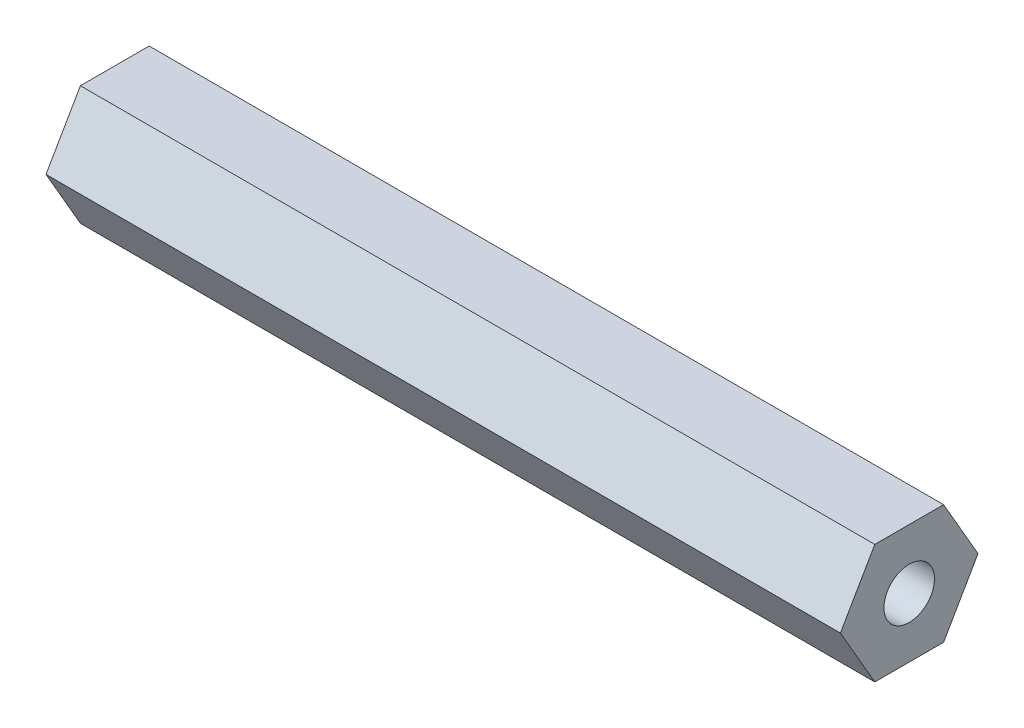
ISO-10303-21;
HEADER;
FILE_DESCRIPTION(('STEP AP214'),'2;1');
FILE_NAME('part.step','',(''),(''),'','','');
FILE_SCHEMA(('AUTOMOTIVE_DESIGN { 1 0 10303 214 1 1 1 1 }'));
ENDSEC;
DATA;
#1=APPLICATION_CONTEXT('core data for automotive mechanical design processes');
#2=APPLICATION_PROTOCOL_DEFINITION('international standard','automotive_design',2000,#1);
#3=PRODUCT_CONTEXT('',#1,'mechanical');
#4=PRODUCT('Part','Part','',(#3));
#5=PRODUCT_RELATED_PRODUCT_CATEGORY('part','',(#4));
#6=PRODUCT_DEFINITION_FORMATION('','',#4);
#7=PRODUCT_DEFINITION_CONTEXT('part definition',#1,'design');
#8=PRODUCT_DEFINITION('design','',#6,#7);
#9=PRODUCT_DEFINITION_SHAPE('','',#8);
#10=(LENGTH_UNIT() NAMED_UNIT(*) SI_UNIT(.MILLI.,.METRE.));
#11=(NAMED_UNIT(*) PLANE_ANGLE_UNIT() SI_UNIT($,.RADIAN.));
#12=(NAMED_UNIT(*) SI_UNIT($,.STERADIAN.) SOLID_ANGLE_UNIT());
#13=UNCERTAINTY_MEASURE_WITH_UNIT(LENGTH_MEASURE(1.E-05),#10,'distance_accuracy_value','');
#14=(GEOMETRIC_REPRESENTATION_CONTEXT(3) GLOBAL_UNCERTAINTY_ASSIGNED_CONTEXT((#13)) GLOBAL_UNIT_ASSIGNED_CONTEXT((#10,
#11,#12)) REPRESENTATION_CONTEXT('',''));
#15=CARTESIAN_POINT('',(0.,0.,0.));
#16=DIRECTION('',(0.,0.,1.));
#17=DIRECTION('',(1.,0.,0.));
#18=AXIS2_PLACEMENT_3D('',#15,#16,#17);
#19=CARTESIAN_POINT('',(38.1,0.,0.));
#20=DIRECTION('',(1.,0.,0.));
#21=DIRECTION('',(0.,1.,0.));
#22=AXIS2_PLACEMENT_3D('',#19,#20,#21);
#23=PLANE('',#22);
#24=CARTESIAN_POINT('',(38.1,0.,0.));
#25=DIRECTION('',(1.,0.,0.));
#26=DIRECTION('',(0.,0.,-1.));
#27=AXIS2_PLACEMENT_3D('',#24,#25,#26);
#28=CIRCLE('',#27,2.0193);
#29=CARTESIAN_POINT('',(38.1,0.,-2.0193));
#30=VERTEX_POINT('',#29);
#31=EDGE_CURVE('E166',#30,#30,#28,.T.);
#32=ORIENTED_EDGE('',*,*,#31,.F.);
#33=EDGE_LOOP('',(#32));
#34=FACE_BOUND('',#33,.T.);
#35=DIRECTION('',(0.,0.866025403784442,-0.5));
#36=VECTOR('',#35,1.);
#37=CARTESIAN_POINT('',(38.1,-4.7625,-2.74963065701564));
#38=LINE('',#37,#36);
#39=CARTESIAN_POINT('',(38.1,-4.7625,-2.74963065701564));
#40=VERTEX_POINT('',#39);
#41=CARTESIAN_POINT('',(38.1,0.,-5.49926131403117));
#42=VERTEX_POINT('',#41);
#43=EDGE_CURVE('E162',#40,#42,#38,.T.);
#44=ORIENTED_EDGE('',*,*,#43,.T.);
#45=DIRECTION('',(0.,0.866025403784438,0.5));
#46=VECTOR('',#45,1.);
#47=CARTESIAN_POINT('',(38.1,0.,-5.49926131403117));
#48=LINE('',#47,#46);
#49=CARTESIAN_POINT('',(38.1,4.7625,-2.74963065701557));
#50=VERTEX_POINT('',#49);
#51=EDGE_CURVE('E98',#42,#50,#48,.T.);
#52=ORIENTED_EDGE('',*,*,#51,.T.);
#53=DIRECTION('',(0.,0.,1.));
#54=VECTOR('',#53,1.);
#55=CARTESIAN_POINT('',(38.1,4.7625,-2.74963065701557));
#56=LINE('',#55,#54);
#57=CARTESIAN_POINT('',(38.1,4.7625,2.7496306570156));
#58=VERTEX_POINT('',#57);
#59=EDGE_CURVE('E138',#50,#58,#56,.T.);
#60=ORIENTED_EDGE('',*,*,#59,.T.);
#61=DIRECTION('',(0.,-0.866025403784442,0.5));
#62=VECTOR('',#61,1.);
#63=CARTESIAN_POINT('',(38.1,4.7625,2.7496306570156));
#64=LINE('',#63,#62);
#65=CARTESIAN_POINT('',(38.1,0.,5.49926131403117));
#66=VERTEX_POINT('',#65);
#67=EDGE_CURVE('E135',#58,#66,#64,.T.);
#68=ORIENTED_EDGE('',*,*,#67,.T.);
#69=DIRECTION('',(0.,-0.866025403784435,-0.500000000000007));
#70=VECTOR('',#69,1.);
#71=CARTESIAN_POINT('',(38.1,0.,5.49926131403117));
#72=LINE('',#71,#70);
#73=CARTESIAN_POINT('',(38.1,-4.7625,2.74963065701554));
#74=VERTEX_POINT('',#73);
#75=EDGE_CURVE('E157',#66,#74,#72,.T.);
#76=ORIENTED_EDGE('',*,*,#75,.T.);
#77=DIRECTION('',(0.,0.,-1.));
#78=VECTOR('',#77,1.);
#79=CARTESIAN_POINT('',(38.1,-4.7625,2.74963065701554));
#80=LINE('',#79,#78);
#81=EDGE_CURVE('E55',#74,#40,#80,.T.);
#82=ORIENTED_EDGE('',*,*,#81,.T.);
#83=EDGE_LOOP('',(#44,#52,#60,#68,#76,#82));
#84=FACE_BOUND('',#83,.T.);
#85=ADVANCED_FACE('F47',(#34,#84),#23,.T.);
#86=CARTESIAN_POINT('',(38.1,-4.7625,2.74963065701554));
#87=DIRECTION('',(0.,1.,0.));
#88=DIRECTION('',(0.,0.,-1.));
#89=AXIS2_PLACEMENT_3D('',#86,#87,#88);
#90=PLANE('',#89);
#91=DIRECTION('',(-1.,0.,0.));
#92=VECTOR('',#91,1.);
#93=CARTESIAN_POINT('',(38.1,-4.7625,2.74963065701554));
#94=LINE('',#93,#92);
#95=CARTESIAN_POINT('',(-25.4,-4.76250000000003,2.74963065701553));
#96=VERTEX_POINT('',#95);
#97=EDGE_CURVE('E154',#74,#96,#94,.T.);
#98=ORIENTED_EDGE('',*,*,#97,.T.);
#99=DIRECTION('',(0.,0.,-1.));
#100=VECTOR('',#99,1.);
#101=CARTESIAN_POINT('',(-25.4,-4.7625,-5.49926131403119));
#102=LINE('',#101,#100);
#103=CARTESIAN_POINT('',(-25.4,-4.76250000000001,-2.74963065701564));
#104=VERTEX_POINT('',#103);
#105=EDGE_CURVE('E131',#96,#104,#102,.T.);
#106=ORIENTED_EDGE('',*,*,#105,.T.);
#107=DIRECTION('',(-1.,0.,0.));
#108=VECTOR('',#107,1.);
#109=CARTESIAN_POINT('',(38.1,-4.7625,-2.74963065701564));
#110=LINE('',#109,#108);
#111=EDGE_CURVE('E153',#40,#104,#110,.T.);
#112=ORIENTED_EDGE('',*,*,#111,.F.);
#113=ORIENTED_EDGE('',*,*,#81,.F.);
#114=EDGE_LOOP('',(#98,#106,#112,#113));
#115=FACE_BOUND('',#114,.T.);
#116=ADVANCED_FACE('F188',(#115),#90,.F.);
#117=CARTESIAN_POINT('',(38.1,0.,5.49926131403117));
#118=DIRECTION('',(0.,0.500000000000007,-0.866025403784435));
#119=DIRECTION('',(-1.,0.,0.));
#120=AXIS2_PLACEMENT_3D('',#117,#118,#119);
#121=PLANE('',#120);
#122=DIRECTION('',(-1.,0.,0.));
#123=VECTOR('',#122,1.);
#124=CARTESIAN_POINT('',(38.1,0.,5.49926131403117));
#125=LINE('',#124,#123);
#126=CARTESIAN_POINT('',(-25.4,0.,5.49926131403117));
#127=VERTEX_POINT('',#126);
#128=EDGE_CURVE('E144',#66,#127,#125,.T.);
#129=ORIENTED_EDGE('',*,*,#128,.T.);
#130=DIRECTION('',(0.,-0.866025403784435,-0.500000000000007));
#131=VECTOR('',#130,1.);
#132=CARTESIAN_POINT('',(-25.4,0.,5.49926131403117));
#133=LINE('',#132,#131);
#134=EDGE_CURVE('E119',#127,#96,#133,.T.);
#135=ORIENTED_EDGE('',*,*,#134,.T.);
#136=ORIENTED_EDGE('',*,*,#97,.F.);
#137=ORIENTED_EDGE('',*,*,#75,.F.);
#138=EDGE_LOOP('',(#129,#135,#136,#137));
#139=FACE_BOUND('',#138,.T.);
#140=ADVANCED_FACE('F49',(#139),#121,.F.);
#141=CARTESIAN_POINT('',(38.1,4.7625,2.7496306570156));
#142=DIRECTION('',(0.,-0.5,-0.866025403784442));
#143=DIRECTION('',(0.,-0.866025403784442,0.5));
#144=AXIS2_PLACEMENT_3D('',#141,#142,#143);
#145=PLANE('',#144);
#146=DIRECTION('',(-1.,0.,0.));
#147=VECTOR('',#146,1.);
#148=CARTESIAN_POINT('',(38.1,4.7625,2.7496306570156));
#149=LINE('',#148,#147);
#150=CARTESIAN_POINT('',(-25.4,4.76249999999998,2.7496306570156));
#151=VERTEX_POINT('',#150);
#152=EDGE_CURVE('E129',#58,#151,#149,.T.);
#153=ORIENTED_EDGE('',*,*,#152,.T.);
#154=DIRECTION('',(0.,-0.866025403784439,0.499999999999999));
#155=VECTOR('',#154,1.);
#156=CARTESIAN_POINT('',(-25.4,4.7625,2.7496306570156));
#157=LINE('',#156,#155);
#158=EDGE_CURVE('E114',#151,#127,#157,.T.);
#159=ORIENTED_EDGE('',*,*,#158,.T.);
#160=ORIENTED_EDGE('',*,*,#128,.F.);
#161=ORIENTED_EDGE('',*,*,#67,.F.);
#162=EDGE_LOOP('',(#153,#159,#160,#161));
#163=FACE_BOUND('',#162,.T.);
#164=ADVANCED_FACE('F133',(#163),#145,.F.);
#165=CARTESIAN_POINT('',(38.1,4.7625,-2.74963065701557));
#166=DIRECTION('',(0.,-1.,0.));
#167=DIRECTION('',(0.,0.,-1.));
#168=AXIS2_PLACEMENT_3D('',#165,#166,#167);
#169=PLANE('',#168);
#170=DIRECTION('',(-1.,0.,0.));
#171=VECTOR('',#170,1.);
#172=CARTESIAN_POINT('',(38.1,4.7625,-2.74963065701557));
#173=LINE('',#172,#171);
#174=CARTESIAN_POINT('',(-25.4,4.7625,-2.74963065701558));
#175=VERTEX_POINT('',#174);
#176=EDGE_CURVE('E130',#50,#175,#173,.T.);
#177=ORIENTED_EDGE('',*,*,#176,.T.);
#178=DIRECTION('',(0.,0.,-1.));
#179=VECTOR('',#178,1.);
#180=CARTESIAN_POINT('',(-25.4,4.76250000000001,-5.49926131403115));
#181=LINE('',#180,#179);
#182=EDGE_CURVE('E117',#151,#175,#181,.T.);
#183=ORIENTED_EDGE('',*,*,#182,.F.);
#184=ORIENTED_EDGE('',*,*,#152,.F.);
#185=ORIENTED_EDGE('',*,*,#59,.F.);
#186=EDGE_LOOP('',(#177,#183,#184,#185));
#187=FACE_BOUND('',#186,.T.);
#188=ADVANCED_FACE('F128',(#187),#169,.F.);
#189=CARTESIAN_POINT('',(38.1,0.,-5.49926131403117));
#190=DIRECTION('',(0.,-0.5,0.866025403784438));
#191=DIRECTION('',(-1.,0.,0.));
#192=AXIS2_PLACEMENT_3D('',#189,#190,#191);
#193=PLANE('',#192);
#194=DIRECTION('',(-1.,0.,0.));
#195=VECTOR('',#194,1.);
#196=CARTESIAN_POINT('',(38.1,0.,-5.49926131403117));
#197=LINE('',#196,#195);
#198=CARTESIAN_POINT('',(-25.4,0.,-5.49926131403117));
#199=VERTEX_POINT('',#198);
#200=EDGE_CURVE('E150',#42,#199,#197,.T.);
#201=ORIENTED_EDGE('',*,*,#200,.T.);
#202=DIRECTION('',(0.,0.866025403784438,0.5));
#203=VECTOR('',#202,1.);
#204=CARTESIAN_POINT('',(-25.4,0.,-5.49926131403117));
#205=LINE('',#204,#203);
#206=EDGE_CURVE('E62',#199,#175,#205,.T.);
#207=ORIENTED_EDGE('',*,*,#206,.T.);
#208=ORIENTED_EDGE('',*,*,#176,.F.);
#209=ORIENTED_EDGE('',*,*,#51,.F.);
#210=EDGE_LOOP('',(#201,#207,#208,#209));
#211=FACE_BOUND('',#210,.T.);
#212=ADVANCED_FACE('F191',(#211),#193,.F.);
#213=CARTESIAN_POINT('',(38.1,-4.7625,-2.74963065701564));
#214=DIRECTION('',(0.,0.5,0.866025403784442));
#215=DIRECTION('',(1.,0.,0.));
#216=AXIS2_PLACEMENT_3D('',#213,#214,#215);
#217=PLANE('',#216);
#218=ORIENTED_EDGE('',*,*,#111,.T.);
#219=DIRECTION('',(0.,0.866025403784439,-0.499999999999999));
#220=VECTOR('',#219,1.);
#221=CARTESIAN_POINT('',(-25.4,-4.7625,-2.74963065701564));
#222=LINE('',#221,#220);
#223=EDGE_CURVE('E186',#104,#199,#222,.T.);
#224=ORIENTED_EDGE('',*,*,#223,.T.);
#225=ORIENTED_EDGE('',*,*,#200,.F.);
#226=ORIENTED_EDGE('',*,*,#43,.F.);
#227=EDGE_LOOP('',(#218,#224,#225,#226));
#228=FACE_BOUND('',#227,.T.);
#229=ADVANCED_FACE('F184',(#228),#217,.F.);
#230=CARTESIAN_POINT('',(-25.4,-4.7625,-5.49926131403119));
#231=DIRECTION('',(1.,0.,0.));
#232=DIRECTION('',(0.,0.,-1.));
#233=AXIS2_PLACEMENT_3D('',#230,#231,#232);
#234=PLANE('',#233);
#235=CARTESIAN_POINT('',(-25.4,0.,0.));
#236=DIRECTION('',(1.,0.,0.));
#237=DIRECTION('',(0.,0.,-1.));
#238=AXIS2_PLACEMENT_3D('',#235,#236,#237);
#239=CIRCLE('',#238,2.0193);
#240=CARTESIAN_POINT('',(-25.4,0.,-2.0193));
#241=VERTEX_POINT('',#240);
#242=EDGE_CURVE('E11',#241,#241,#239,.F.);
#243=ORIENTED_EDGE('',*,*,#242,.F.);
#244=EDGE_LOOP('',(#243));
#245=FACE_BOUND('',#244,.T.);
#246=ORIENTED_EDGE('',*,*,#158,.F.);
#247=ORIENTED_EDGE('',*,*,#182,.T.);
#248=ORIENTED_EDGE('',*,*,#206,.F.);
#249=ORIENTED_EDGE('',*,*,#223,.F.);
#250=ORIENTED_EDGE('',*,*,#105,.F.);
#251=ORIENTED_EDGE('',*,*,#134,.F.);
#252=EDGE_LOOP('',(#246,#247,#248,#249,#250,#251));
#253=FACE_BOUND('',#252,.T.);
#254=ADVANCED_FACE('F116',(#245,#253),#234,.F.);
#255=CARTESIAN_POINT('',(-38.1,0.,0.));
#256=DIRECTION('',(-1.,0.,0.));
#257=DIRECTION('',(0.,0.,1.));
#258=AXIS2_PLACEMENT_3D('',#255,#256,#257);
#259=CYLINDRICAL_SURFACE('',#258,2.0193);
#260=ORIENTED_EDGE('',*,*,#31,.T.);
#261=EDGE_LOOP('',(#260));
#262=FACE_BOUND('',#261,.T.);
#263=ORIENTED_EDGE('',*,*,#242,.T.);
#264=EDGE_LOOP('',(#263));
#265=FACE_BOUND('',#264,.T.);
#266=ADVANCED_FACE('F210',(#262,#265),#259,.F.);
#267=CLOSED_SHELL('',(#85,#116,#140,#164,#188,#212,#229,#254,#266));
#268=MANIFOLD_SOLID_BREP('B2',#267);
#269=ADVANCED_BREP_SHAPE_REPRESENTATION('',(#18,#268),#14);
#270=SHAPE_DEFINITION_REPRESENTATION(#9,#269);
ENDSEC;
END-ISO-10303-21;
